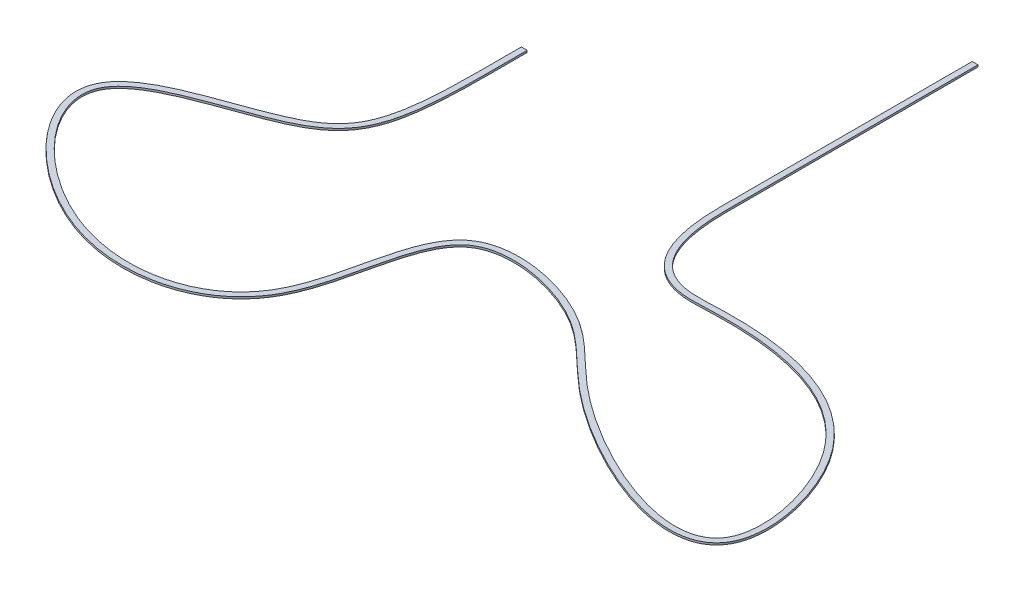
ISO-10303-21;
HEADER;
FILE_DESCRIPTION(('STEP AP214'),'2;1');
FILE_NAME('part.step','',(''),(''),'','','');
FILE_SCHEMA(('AUTOMOTIVE_DESIGN { 1 0 10303 214 1 1 1 1 }'));
ENDSEC;
DATA;
#1=APPLICATION_CONTEXT('core data for automotive mechanical design processes');
#2=APPLICATION_PROTOCOL_DEFINITION('international standard','automotive_design',2000,#1);
#3=PRODUCT_CONTEXT('',#1,'mechanical');
#4=PRODUCT('Part','Part','',(#3));
#5=PRODUCT_RELATED_PRODUCT_CATEGORY('part','',(#4));
#6=PRODUCT_DEFINITION_FORMATION('','',#4);
#7=PRODUCT_DEFINITION_CONTEXT('part definition',#1,'design');
#8=PRODUCT_DEFINITION('design','',#6,#7);
#9=PRODUCT_DEFINITION_SHAPE('','',#8);
#10=(LENGTH_UNIT() NAMED_UNIT(*) SI_UNIT(.MILLI.,.METRE.));
#11=(NAMED_UNIT(*) PLANE_ANGLE_UNIT() SI_UNIT($,.RADIAN.));
#12=(NAMED_UNIT(*) SI_UNIT($,.STERADIAN.) SOLID_ANGLE_UNIT());
#13=UNCERTAINTY_MEASURE_WITH_UNIT(LENGTH_MEASURE(1.E-05),#10,'distance_accuracy_value','');
#14=(GEOMETRIC_REPRESENTATION_CONTEXT(3) GLOBAL_UNCERTAINTY_ASSIGNED_CONTEXT((#13)) GLOBAL_UNIT_ASSIGNED_CONTEXT((#10,
#11,#12)) REPRESENTATION_CONTEXT('',''));
#15=CARTESIAN_POINT('',(0.,0.,0.));
#16=DIRECTION('',(0.,0.,1.));
#17=DIRECTION('',(1.,0.,0.));
#18=AXIS2_PLACEMENT_3D('',#15,#16,#17);
#19=CARTESIAN_POINT('',(-1770.,10.,2.20436423846524E-13));
#20=DIRECTION('',(-1.,0.,0.));
#21=DIRECTION('',(0.,0.,1.));
#22=AXIS2_PLACEMENT_3D('',#19,#20,#21);
#23=PLANE('',#22);
#24=DIRECTION('',(0.,0.,-1.));
#25=VECTOR('',#24,1.);
#26=CARTESIAN_POINT('',(-1770.,0.,2.20436423846524E-13));
#27=LINE('',#26,#25);
#28=CARTESIAN_POINT('',(-1770.,0.,200.));
#29=VERTEX_POINT('',#28);
#30=CARTESIAN_POINT('',(-1770.,0.,-1100.));
#31=VERTEX_POINT('',#30);
#32=EDGE_CURVE('E85',#29,#31,#27,.T.);
#33=ORIENTED_EDGE('',*,*,#32,.T.);
#34=DIRECTION('',(0.,-1.,0.));
#35=VECTOR('',#34,1.);
#36=CARTESIAN_POINT('',(-1770.,10.,-1100.));
#37=LINE('',#36,#35);
#38=CARTESIAN_POINT('',(-1770.,10.,-1100.));
#39=VERTEX_POINT('',#38);
#40=EDGE_CURVE('E11',#39,#31,#37,.T.);
#41=ORIENTED_EDGE('',*,*,#40,.F.);
#42=DIRECTION('',(0.,0.,-1.));
#43=VECTOR('',#42,1.);
#44=CARTESIAN_POINT('',(-1770.,10.,2.20436423846524E-13));
#45=LINE('',#44,#43);
#46=CARTESIAN_POINT('',(-1770.,10.,200.));
#47=VERTEX_POINT('',#46);
#48=EDGE_CURVE('E91',#47,#39,#45,.T.);
#49=ORIENTED_EDGE('',*,*,#48,.F.);
#50=DIRECTION('',(0.,-1.,0.));
#51=VECTOR('',#50,1.);
#52=CARTESIAN_POINT('',(-1770.,10.,200.));
#53=LINE('',#52,#51);
#54=EDGE_CURVE('E125',#47,#29,#53,.T.);
#55=ORIENTED_EDGE('',*,*,#54,.T.);
#56=EDGE_LOOP('',(#33,#41,#49,#55));
#57=FACE_BOUND('',#56,.T.);
#58=ADVANCED_FACE('F33',(#57),#23,.F.);
#59=CARTESIAN_POINT('',(-1800.,10.,-1100.));
#60=DIRECTION('',(0.,0.,1.));
#61=DIRECTION('',(1.,0.,0.));
#62=AXIS2_PLACEMENT_3D('',#59,#60,#61);
#63=PLANE('',#62);
#64=DIRECTION('',(-1.,0.,0.));
#65=VECTOR('',#64,1.);
#66=CARTESIAN_POINT('',(-1800.,0.,-1100.));
#67=LINE('',#66,#65);
#68=CARTESIAN_POINT('',(-1800.,0.,-1100.));
#69=VERTEX_POINT('',#68);
#70=EDGE_CURVE('E199',#31,#69,#67,.T.);
#71=ORIENTED_EDGE('',*,*,#70,.T.);
#72=DIRECTION('',(0.,-1.,0.));
#73=VECTOR('',#72,1.);
#74=CARTESIAN_POINT('',(-1800.,10.,-1100.));
#75=LINE('',#74,#73);
#76=CARTESIAN_POINT('',(-1800.,10.,-1100.));
#77=VERTEX_POINT('',#76);
#78=EDGE_CURVE('E41',#77,#69,#75,.T.);
#79=ORIENTED_EDGE('',*,*,#78,.F.);
#80=DIRECTION('',(-1.,0.,0.));
#81=VECTOR('',#80,1.);
#82=CARTESIAN_POINT('',(-1800.,10.,-1100.));
#83=LINE('',#82,#81);
#84=EDGE_CURVE('E168',#39,#77,#83,.T.);
#85=ORIENTED_EDGE('',*,*,#84,.F.);
#86=ORIENTED_EDGE('',*,*,#40,.T.);
#87=EDGE_LOOP('',(#71,#79,#85,#86));
#88=FACE_BOUND('',#87,.T.);
#89=ADVANCED_FACE('F198',(#88),#63,.F.);
#90=CARTESIAN_POINT('',(-1800.,10.,2.20436423846524E-13));
#91=DIRECTION('',(1.,0.,0.));
#92=DIRECTION('',(0.,0.,-1.));
#93=AXIS2_PLACEMENT_3D('',#90,#91,#92);
#94=PLANE('',#93);
#95=DIRECTION('',(0.,0.,1.));
#96=VECTOR('',#95,1.);
#97=CARTESIAN_POINT('',(-1800.,0.,2.20436423846524E-13));
#98=LINE('',#97,#96);
#99=CARTESIAN_POINT('',(-1800.,0.,200.));
#100=VERTEX_POINT('',#99);
#101=EDGE_CURVE('E194',#69,#100,#98,.T.);
#102=ORIENTED_EDGE('',*,*,#101,.T.);
#103=DIRECTION('',(0.,-1.,0.));
#104=VECTOR('',#103,1.);
#105=CARTESIAN_POINT('',(-1800.,10.,200.));
#106=LINE('',#105,#104);
#107=CARTESIAN_POINT('',(-1800.,10.,200.));
#108=VERTEX_POINT('',#107);
#109=EDGE_CURVE('E187',#108,#100,#106,.T.);
#110=ORIENTED_EDGE('',*,*,#109,.F.);
#111=DIRECTION('',(0.,0.,1.));
#112=VECTOR('',#111,1.);
#113=CARTESIAN_POINT('',(-1800.,10.,2.20436423846524E-13));
#114=LINE('',#113,#112);
#115=EDGE_CURVE('E163',#77,#108,#114,.T.);
#116=ORIENTED_EDGE('',*,*,#115,.F.);
#117=ORIENTED_EDGE('',*,*,#78,.T.);
#118=EDGE_LOOP('',(#102,#110,#116,#117));
#119=FACE_BOUND('',#118,.T.);
#120=ADVANCED_FACE('F156',(#119),#94,.F.);
#121=CARTESIAN_POINT('',(-1800.,10.,200.));
#122=CARTESIAN_POINT('',(-1800.,10.,543.775958973497));
#123=CARTESIAN_POINT('',(-1644.85776394996,10.,709.700816725594));
#124=CARTESIAN_POINT('',(-1056.46575384119,10.,667.760403918157));
#125=CARTESIAN_POINT('',(-390.715014946576,10.,787.827323273447));
#126=CARTESIAN_POINT('',(-115.852661247006,10.,2042.603655943));
#127=CARTESIAN_POINT('',(-1266.95146887229,10.,1497.62651654821));
#128=CARTESIAN_POINT('',(-1650.97261613424,10.,1003.67240354257));
#129=CARTESIAN_POINT('',(-2504.98744337853,10.,816.756429146126));
#130=CARTESIAN_POINT('',(-2411.23417557477,10.,1892.36294751749));
#131=CARTESIAN_POINT('',(-3401.54940594687,10.,2117.29933089096));
#132=CARTESIAN_POINT('',(-4308.06526892586,10.,1186.37689890447));
#133=CARTESIAN_POINT('',(-3088.78517191244,10.,965.527321936233));
#134=CARTESIAN_POINT('',(-3000.,10.,658.386110554316));
#135=CARTESIAN_POINT('',(-3000.,10.,200.));
#136=B_SPLINE_CURVE_WITH_KNOTS('',3,(#121,#122,#123,#124,#125,#126,#127,#128,#129,#130,#131,
#132,#133,#134,#135),.UNSPECIFIED.,.F.,.F.,(4,1,1,1,1,1,1,1,1,1,1,1,4),(0.,0.0680895671874227,
0.0859276568916471,0.203459509226807,0.276471939193528,0.401964241474322,0.455969173119954,
0.527914688829046,0.623416846556313,0.716393812519059,0.819188821629148,0.909166056503487,1.),.UNSPECIFIED.);
#137=DIRECTION('',(0.,-1.,0.));
#138=VECTOR('',#137,1.);
#139=SURFACE_OF_LINEAR_EXTRUSION('',#136,#138);
#140=CARTESIAN_POINT('',(-1800.,0.,200.));
#141=CARTESIAN_POINT('',(-1800.,0.,543.775958973497));
#142=CARTESIAN_POINT('',(-1644.85776394996,0.,709.700816725594));
#143=CARTESIAN_POINT('',(-1056.46575384119,0.,667.760403918157));
#144=CARTESIAN_POINT('',(-390.715014946576,0.,787.827323273447));
#145=CARTESIAN_POINT('',(-115.852661247006,0.,2042.603655943));
#146=CARTESIAN_POINT('',(-1266.95146887229,0.,1497.62651654821));
#147=CARTESIAN_POINT('',(-1650.97261613424,0.,1003.67240354257));
#148=CARTESIAN_POINT('',(-2504.98744337853,0.,816.756429146126));
#149=CARTESIAN_POINT('',(-2411.23417557477,0.,1892.36294751749));
#150=CARTESIAN_POINT('',(-3401.54940594687,0.,2117.29933089096));
#151=CARTESIAN_POINT('',(-4308.06526892586,0.,1186.37689890447));
#152=CARTESIAN_POINT('',(-3088.78517191244,0.,965.527321936233));
#153=CARTESIAN_POINT('',(-3000.,0.,658.386110554316));
#154=CARTESIAN_POINT('',(-3000.,0.,200.));
#155=B_SPLINE_CURVE_WITH_KNOTS('',3,(#140,#141,#142,#143,#144,#145,#146,#147,#148,#149,#150,
#151,#152,#153,#154),.UNSPECIFIED.,.F.,.F.,(4,1,1,1,1,1,1,1,1,1,1,1,4),(0.,0.0680895671874227,
0.0859276568916471,0.203459509226807,0.276471939193528,0.401964241474322,0.455969173119954,
0.527914688829046,0.623416846556313,0.716393812519059,0.819188821629148,0.909166056503487,1.),.UNSPECIFIED.);
#156=CARTESIAN_POINT('',(-3000.,0.,200.));
#157=VERTEX_POINT('',#156);
#158=EDGE_CURVE('E200',#100,#157,#155,.T.);
#159=ORIENTED_EDGE('',*,*,#158,.T.);
#160=DIRECTION('',(0.,-1.,0.));
#161=VECTOR('',#160,1.);
#162=CARTESIAN_POINT('',(-3000.,10.,200.));
#163=LINE('',#162,#161);
#164=CARTESIAN_POINT('',(-3000.,10.,200.));
#165=VERTEX_POINT('',#164);
#166=EDGE_CURVE('E184',#165,#157,#163,.T.);
#167=ORIENTED_EDGE('',*,*,#166,.F.);
#168=EDGE_CURVE('E158',#108,#165,#136,.T.);
#169=ORIENTED_EDGE('',*,*,#168,.F.);
#170=ORIENTED_EDGE('',*,*,#109,.T.);
#171=EDGE_LOOP('',(#159,#167,#169,#170));
#172=FACE_BOUND('',#171,.T.);
#173=ADVANCED_FACE('F151',(#172),#139,.F.);
#174=CARTESIAN_POINT('',(-3000.,10.,0.));
#175=DIRECTION('',(-1.,0.,0.));
#176=DIRECTION('',(0.,0.,1.));
#177=AXIS2_PLACEMENT_3D('',#174,#175,#176);
#178=PLANE('',#177);
#179=DIRECTION('',(0.,0.,-1.));
#180=VECTOR('',#179,1.);
#181=CARTESIAN_POINT('',(-3000.,0.,0.));
#182=LINE('',#181,#180);
#183=CARTESIAN_POINT('',(-3000.,0.,0.));
#184=VERTEX_POINT('',#183);
#185=EDGE_CURVE('E206',#157,#184,#182,.T.);
#186=ORIENTED_EDGE('',*,*,#185,.T.);
#187=DIRECTION('',(0.,-1.,0.));
#188=VECTOR('',#187,1.);
#189=CARTESIAN_POINT('',(-3000.,10.,0.));
#190=LINE('',#189,#188);
#191=CARTESIAN_POINT('',(-3000.,10.,0.));
#192=VERTEX_POINT('',#191);
#193=EDGE_CURVE('E120',#192,#184,#190,.T.);
#194=ORIENTED_EDGE('',*,*,#193,.F.);
#195=DIRECTION('',(0.,0.,-1.));
#196=VECTOR('',#195,1.);
#197=CARTESIAN_POINT('',(-3000.,10.,0.));
#198=LINE('',#197,#196);
#199=EDGE_CURVE('E111',#165,#192,#198,.T.);
#200=ORIENTED_EDGE('',*,*,#199,.F.);
#201=ORIENTED_EDGE('',*,*,#166,.T.);
#202=EDGE_LOOP('',(#186,#194,#200,#201));
#203=FACE_BOUND('',#202,.T.);
#204=ADVANCED_FACE('F148',(#203),#178,.F.);
#205=CARTESIAN_POINT('',(-3030.,10.,0.));
#206=DIRECTION('',(0.,0.,1.));
#207=DIRECTION('',(1.,0.,0.));
#208=AXIS2_PLACEMENT_3D('',#205,#206,#207);
#209=PLANE('',#208);
#210=DIRECTION('',(-1.,0.,0.));
#211=VECTOR('',#210,1.);
#212=CARTESIAN_POINT('',(-3030.,0.,0.));
#213=LINE('',#212,#211);
#214=CARTESIAN_POINT('',(-3030.,0.,0.));
#215=VERTEX_POINT('',#214);
#216=EDGE_CURVE('E119',#184,#215,#213,.T.);
#217=ORIENTED_EDGE('',*,*,#216,.T.);
#218=DIRECTION('',(0.,-1.,0.));
#219=VECTOR('',#218,1.);
#220=CARTESIAN_POINT('',(-3030.,10.,0.));
#221=LINE('',#220,#219);
#222=CARTESIAN_POINT('',(-3030.,10.,0.));
#223=VERTEX_POINT('',#222);
#224=EDGE_CURVE('E116',#223,#215,#221,.T.);
#225=ORIENTED_EDGE('',*,*,#224,.F.);
#226=DIRECTION('',(-1.,0.,0.));
#227=VECTOR('',#226,1.);
#228=CARTESIAN_POINT('',(-3030.,10.,0.));
#229=LINE('',#228,#227);
#230=EDGE_CURVE('E105',#192,#223,#229,.T.);
#231=ORIENTED_EDGE('',*,*,#230,.F.);
#232=ORIENTED_EDGE('',*,*,#193,.T.);
#233=EDGE_LOOP('',(#217,#225,#231,#232));
#234=FACE_BOUND('',#233,.T.);
#235=ADVANCED_FACE('F117',(#234),#209,.F.);
#236=CARTESIAN_POINT('',(-3030.,10.,0.));
#237=DIRECTION('',(1.,0.,0.));
#238=DIRECTION('',(0.,0.,-1.));
#239=AXIS2_PLACEMENT_3D('',#236,#237,#238);
#240=PLANE('',#239);
#241=DIRECTION('',(0.,0.,1.));
#242=VECTOR('',#241,1.);
#243=CARTESIAN_POINT('',(-3030.,0.,0.));
#244=LINE('',#243,#242);
#245=CARTESIAN_POINT('',(-3030.,0.,200.));
#246=VERTEX_POINT('',#245);
#247=EDGE_CURVE('E78',#215,#246,#244,.T.);
#248=ORIENTED_EDGE('',*,*,#247,.T.);
#249=DIRECTION('',(0.,-1.,0.));
#250=VECTOR('',#249,1.);
#251=CARTESIAN_POINT('',(-3030.,10.,200.));
#252=LINE('',#251,#250);
#253=CARTESIAN_POINT('',(-3030.,10.,200.));
#254=VERTEX_POINT('',#253);
#255=EDGE_CURVE('E121',#254,#246,#252,.T.);
#256=ORIENTED_EDGE('',*,*,#255,.F.);
#257=DIRECTION('',(0.,0.,1.));
#258=VECTOR('',#257,1.);
#259=CARTESIAN_POINT('',(-3030.,10.,0.));
#260=LINE('',#259,#258);
#261=EDGE_CURVE('E109',#223,#254,#260,.T.);
#262=ORIENTED_EDGE('',*,*,#261,.F.);
#263=ORIENTED_EDGE('',*,*,#224,.T.);
#264=EDGE_LOOP('',(#248,#256,#262,#263));
#265=FACE_BOUND('',#264,.T.);
#266=ADVANCED_FACE('F123',(#265),#240,.F.);
#267=CARTESIAN_POINT('',(-3030.,10.,200.));
#268=CARTESIAN_POINT('',(-3030.,10.,202.44468026223));
#269=CARTESIAN_POINT('',(-3030.00256678984,10.,207.346983279905));
#270=CARTESIAN_POINT('',(-3030.01812400814,10.,217.04804120218));
#271=CARTESIAN_POINT('',(-3030.05740794864,10.,229.052437646049));
#272=CARTESIAN_POINT('',(-3030.13722424219,10.,243.241965806248));
#273=CARTESIAN_POINT('',(-3030.28845649301,10.,261.884067124718));
#274=CARTESIAN_POINT('',(-3030.56384189688,10.,284.667648803494));
#275=CARTESIAN_POINT('',(-3031.03984896304,10.,311.19300127468));
#276=CARTESIAN_POINT('',(-3031.66872717967,10.,336.91739267088));
#277=CARTESIAN_POINT('',(-3032.72071490951,10.,370.167689688053));
#278=CARTESIAN_POINT('',(-3034.45393286476,10.,409.799220315622));
#279=CARTESIAN_POINT('',(-3037.25898119917,10.,454.379166511088));
#280=CARTESIAN_POINT('',(-3040.84294969377,10.,496.09249968465));
#281=CARTESIAN_POINT('',(-3045.25683784207,10.,535.049982743481));
#282=CARTESIAN_POINT('',(-3052.31151555034,10.,583.467747888372));
#283=CARTESIAN_POINT('',(-3063.43357501031,10.,637.660079414597));
#284=CARTESIAN_POINT('',(-3080.76493448546,10.,693.52693384983));
#285=CARTESIAN_POINT('',(-3102.3500102706,10.,741.368378302608));
#286=CARTESIAN_POINT('',(-3128.57449992123,10.,782.579038728643));
#287=CARTESIAN_POINT('',(-3160.12592561099,10.,818.701202856934));
#288=CARTESIAN_POINT('',(-3197.96128777108,10.,851.116250208338));
#289=CARTESIAN_POINT('',(-3235.52799002765,10.,875.916153702686));
#290=CARTESIAN_POINT('',(-3269.55411577885,10.,894.840403096033));
#291=CARTESIAN_POINT('',(-3297.17028016858,10.,908.686773964042));
#292=CARTESIAN_POINT('',(-3326.76723459712,10.,922.266159263917));
#293=CARTESIAN_POINT('',(-3368.47074079309,10.,940.048003300012));
#294=CARTESIAN_POINT('',(-3424.17276609938,10.,961.792286148216));
#295=CARTESIAN_POINT('',(-3494.70503097047,10.,987.573106580423));
#296=CARTESIAN_POINT('',(-3566.97385975147,10.,1013.57433379743));
#297=CARTESIAN_POINT('',(-3639.07252594547,10.,1040.3687673254));
#298=CARTESIAN_POINT('',(-3709.14181427762,10.,1068.57149167922));
#299=CARTESIAN_POINT('',(-3775.37176871665,10.,1098.85629541707));
#300=CARTESIAN_POINT('',(-3836.00695500734,10.,1132.00152055109));
#301=CARTESIAN_POINT('',(-3889.31678833922,10.,1168.9757265393));
#302=CARTESIAN_POINT('',(-3926.11845085338,10.,1204.07393873081));
#303=CARTESIAN_POINT('',(-3949.73224874865,10.,1235.52501961107));
#304=CARTESIAN_POINT('',(-3961.68523529989,10.,1256.70098547685));
#305=CARTESIAN_POINT('',(-3969.31242434488,10.,1274.59391953308));
#306=CARTESIAN_POINT('',(-3975.52712625,10.,1292.91049616912));
#307=CARTESIAN_POINT('',(-3980.70403246672,10.,1316.47601152373));
#308=CARTESIAN_POINT('',(-3982.96666732529,10.,1345.47364758785));
#309=CARTESIAN_POINT('',(-3981.08090854941,10.,1384.75673749048));
#310=CARTESIAN_POINT('',(-3970.24921824339,10.,1434.58773513265));
#311=CARTESIAN_POINT('',(-3945.61552459571,10.,1494.86054712761));
#312=CARTESIAN_POINT('',(-3910.76909211951,10.,1555.15322765712));
#313=CARTESIAN_POINT('',(-3866.87655204438,10.,1614.8985842291));
#314=CARTESIAN_POINT('',(-3797.70187990741,10.,1692.91817347662));
#315=CARTESIAN_POINT('',(-3714.5891943424,10.,1766.95876076713));
#316=CARTESIAN_POINT('',(-3621.53078436277,10.,1833.65102352948));
#317=CARTESIAN_POINT('',(-3547.74988015527,10.,1879.10122375944));
#318=CARTESIAN_POINT('',(-3470.95798782769,10.,1919.07688843198));
#319=CARTESIAN_POINT('',(-3405.26515749913,10.,1947.05882325373));
#320=CARTESIAN_POINT('',(-3352.15092319672,10.,1965.7590894277));
#321=CARTESIAN_POINT('',(-3298.90758680479,10.,1981.8639978442));
#322=CARTESIAN_POINT('',(-3232.30478941012,10.,1997.18768236058));
#323=CARTESIAN_POINT('',(-3152.95269088712,10.,2007.94530770781));
#324=CARTESIAN_POINT('',(-3048.76963456727,10.,2012.20366296019));
#325=CARTESIAN_POINT('',(-2923.18761040135,10.,1998.76134898343));
#326=CARTESIAN_POINT('',(-2808.15741515661,10.,1960.56234263952));
#327=CARTESIAN_POINT('',(-2725.24500383772,10.,1915.25416550836));
#328=CARTESIAN_POINT('',(-2668.366927617,10.,1873.94133501317));
#329=CARTESIAN_POINT('',(-2626.03502170989,10.,1833.46896077764));
#330=CARTESIAN_POINT('',(-2595.60981509827,10.,1797.52865155095));
#331=CARTESIAN_POINT('',(-2574.60280289815,10.,1768.8220596565));
#332=CARTESIAN_POINT('',(-2555.53351124245,10.,1738.36463936736));
#333=CARTESIAN_POINT('',(-2538.47690065025,10.,1706.56190141997));
#334=CARTESIAN_POINT('',(-2523.16833259899,10.,1673.58842288324));
#335=CARTESIAN_POINT('',(-2504.82806612773,10.,1628.31895502311));
#336=CARTESIAN_POINT('',(-2485.26527832442,10.,1569.72592814881));
#337=CARTESIAN_POINT('',(-2459.07674383719,10.,1473.53737758828));
#338=CARTESIAN_POINT('',(-2437.6009988882,10.,1376.4116244579));
#339=CARTESIAN_POINT('',(-2415.35342626781,10.,1284.0649564692));
#340=CARTESIAN_POINT('',(-2397.01659975555,10.,1218.70885942529));
#341=CARTESIAN_POINT('',(-2375.84355131772,10.,1158.80447303158));
#342=CARTESIAN_POINT('',(-2350.80649780114,10.,1105.90597815358));
#343=CARTESIAN_POINT('',(-2326.05115687181,10.,1068.84210020599));
#344=CARTESIAN_POINT('',(-2303.5286706809,10.,1043.84828198856));
#345=CARTESIAN_POINT('',(-2288.20414804714,10.,1030.19801575286));
#346=CARTESIAN_POINT('',(-2275.08539370571,10.,1020.46260096111));
#347=CARTESIAN_POINT('',(-2261.37226191134,10.,1011.53750141805));
#348=CARTESIAN_POINT('',(-2242.77503625664,10.,1001.72441998259));
#349=CARTESIAN_POINT('',(-2218.20902846381,10.,992.055597619226));
#350=CARTESIAN_POINT('',(-2182.67550462291,10.,981.97676893033));
#351=CARTESIAN_POINT('',(-2133.5428540093,10.,974.635212352723));
#352=CARTESIAN_POINT('',(-2068.92496513719,10.,973.960416534671));
#353=CARTESIAN_POINT('',(-2000.63486849878,10.,980.879053648074));
#354=CARTESIAN_POINT('',(-1930.62363706019,10.,994.698759185792));
#355=CARTESIAN_POINT('',(-1860.80117514704,10.,1014.64078034145));
#356=CARTESIAN_POINT('',(-1804.33934481401,10.,1035.66868330747));
#357=CARTESIAN_POINT('',(-1761.1360388575,10.,1054.69806181579));
#358=CARTESIAN_POINT('',(-1729.95180312396,10.,1069.95859176504));
#359=CARTESIAN_POINT('',(-1700.21149425171,10.,1086.08890541635));
#360=CARTESIAN_POINT('',(-1672.18010006703,10.,1102.96511617994));
#361=CARTESIAN_POINT('',(-1645.56824606733,10.,1120.62338221644));
#362=CARTESIAN_POINT('',(-1611.64269172637,10.,1145.16268059825));
#363=CARTESIAN_POINT('',(-1571.52863480319,10.,1177.65396346366));
#364=CARTESIAN_POINT('',(-1525.13823940885,10.,1219.32908618434));
#365=CARTESIAN_POINT('',(-1478.63882768336,10.,1263.37878955179));
#366=CARTESIAN_POINT('',(-1438.27384428108,10.,1301.72055375505));
#367=CARTESIAN_POINT('',(-1404.10166103781,10.,1333.12662338878));
#368=CARTESIAN_POINT('',(-1377.30857403191,10.,1356.97636767243));
#369=CARTESIAN_POINT('',(-1349.11595266121,10.,1381.06430101926));
#370=CARTESIAN_POINT('',(-1309.4116860319,10.,1413.34336745606));
#371=CARTESIAN_POINT('',(-1256.29263528121,10.,1453.60329377825));
#372=CARTESIAN_POINT('',(-1187.87308852633,10.,1501.16400635612));
#373=CARTESIAN_POINT('',(-1091.72023474866,10.,1562.63600046953));
#374=CARTESIAN_POINT('',(-964.711485154699,10.,1634.09420715975));
#375=CARTESIAN_POINT('',(-809.130631111526,10.,1705.53925452926));
#376=CARTESIAN_POINT('',(-683.143800982305,10.,1748.35807532738));
#377=CARTESIAN_POINT('',(-588.060593850463,10.,1769.57939621431));
#378=CARTESIAN_POINT('',(-520.373003956374,10.,1778.14849527007));
#379=CARTESIAN_POINT('',(-457.011107667601,10.,1778.41475552728));
#380=CARTESIAN_POINT('',(-398.643469016427,10.,1769.15473299937));
#381=CARTESIAN_POINT('',(-354.952102158264,10.,1752.08820605141));
#382=CARTESIAN_POINT('',(-324.014060839887,10.,1731.97421397463));
#383=CARTESIAN_POINT('',(-303.227579333491,10.,1713.57186275693));
#384=CARTESIAN_POINT('',(-288.250771315608,10.,1695.51553361057));
#385=CARTESIAN_POINT('',(-277.838355606863,10.,1679.50915900354));
#386=CARTESIAN_POINT('',(-268.557478325612,10.,1662.6616615934));
#387=CARTESIAN_POINT('',(-258.960804034451,10.,1640.14140507716));
#388=CARTESIAN_POINT('',(-247.525559019261,10.,1601.43587709904));
#389=CARTESIAN_POINT('',(-239.930582836491,10.,1548.62900383139));
#390=CARTESIAN_POINT('',(-240.088873901011,10.,1479.68758561624));
#391=CARTESIAN_POINT('',(-248.575943032091,10.,1406.66146019611));
#392=CARTESIAN_POINT('',(-264.657490326098,10.,1331.16604421734));
#393=CARTESIAN_POINT('',(-287.700104096437,10.,1254.90335708829));
#394=CARTESIAN_POINT('',(-317.127338875256,10.,1179.62521342066));
#395=CARTESIAN_POINT('',(-352.390309535108,10.,1107.12873484128));
#396=CARTESIAN_POINT('',(-393.039510754311,10.,1039.16142748892));
#397=CARTESIAN_POINT('',(-438.500486415111,10.,977.718973596922));
#398=CARTESIAN_POINT('',(-504.847882610184,10.,904.377483855463));
#399=CARTESIAN_POINT('',(-597.557567260527,10.,828.133172733128));
#400=CARTESIAN_POINT('',(-721.017084363719,10.,759.174762999476));
#401=CARTESIAN_POINT('',(-831.370487173833,10.,718.37574199146));
#402=CARTESIAN_POINT('',(-922.641439477638,10.,694.420768142469));
#403=CARTESIAN_POINT('',(-992.234696422972,10.,680.469889050314));
#404=CARTESIAN_POINT('',(-1062.61775413724,10.,670.211613646285));
#405=CARTESIAN_POINT('',(-1133.44599841174,10.,663.327883193615));
#406=CARTESIAN_POINT('',(-1192.55500007956,10.,660.142266979799));
#407=CARTESIAN_POINT('',(-1239.72317718289,10.,658.969581147324));
#408=CARTESIAN_POINT('',(-1274.99616358221,10.,658.739624883118));
#409=CARTESIAN_POINT('',(-1304.27208732321,10.,659.057585107903));
#410=CARTESIAN_POINT('',(-1327.59310051896,10.,659.598465100132));
#411=CARTESIAN_POINT('',(-1345.04758331539,10.,660.143281780053));
#412=CARTESIAN_POINT('',(-1362.38335077414,10.,660.819948012066));
#413=CARTESIAN_POINT('',(-1385.19718472514,10.,661.789097925377));
#414=CARTESIAN_POINT('',(-1413.13260064818,10.,662.933694109778));
#415=CARTESIAN_POINT('',(-1445.4598262798,10.,663.598851609646));
#416=CARTESIAN_POINT('',(-1476.35704834531,10.,663.000331669724));
#417=CARTESIAN_POINT('',(-1505.44643721926,10.,660.596707519195));
#418=CARTESIAN_POINT('',(-1533.12244128007,10.,656.050035993142));
#419=CARTESIAN_POINT('',(-1559.33456329788,10.,649.355896109645));
#420=CARTESIAN_POINT('',(-1592.31421988826,10.,637.474865982917));
#421=CARTESIAN_POINT('',(-1629.87210566305,10.,616.930624639397));
#422=CARTESIAN_POINT('',(-1669.43917741045,10.,582.165052240562));
#423=CARTESIAN_POINT('',(-1697.94044284547,10.,543.3842645943));
#424=CARTESIAN_POINT('',(-1717.7804475355,10.,505.615714454527));
#425=CARTESIAN_POINT('',(-1731.06056765678,10.,473.742739490945));
#426=CARTESIAN_POINT('',(-1742.61900187938,10.,438.169198210849));
#427=CARTESIAN_POINT('',(-1752.3298075487,10.,398.765721216262));
#428=CARTESIAN_POINT('',(-1758.7819365191,10.,362.643523781912));
#429=CARTESIAN_POINT('',(-1762.90294184075,10.,331.722987205455));
#430=CARTESIAN_POINT('',(-1765.46003299359,10.,307.50908034012));
#431=CARTESIAN_POINT('',(-1767.47048440508,10.,282.259565392284));
#432=CARTESIAN_POINT('',(-1768.67991445953,10.,260.345781839055));
#433=CARTESIAN_POINT('',(-1769.36185012833,10.,242.284652732584));
#434=CARTESIAN_POINT('',(-1769.72902742436,10.,228.474147380825));
#435=CARTESIAN_POINT('',(-1769.91356736719,10.,216.737336548021));
#436=CARTESIAN_POINT('',(-1769.98761895009,10.,207.224491945918));
#437=CARTESIAN_POINT('',(-1770.,10.,202.402726684964));
#438=CARTESIAN_POINT('',(-1770.,10.,200.));
#439=B_SPLINE_CURVE_WITH_KNOTS('',3,(#267,#268,#269,#270,#271,#272,#273,#274,#275,#276,#277,
#278,#279,#280,#281,#282,#283,#284,#285,#286,#287,#288,#289,#290,#291,#292,#293,#294,#295,#296,
#297,#298,#299,#300,#301,#302,#303,#304,#305,#306,#307,#308,#309,#310,#311,#312,#313,#314,#315,
#316,#317,#318,#319,#320,#321,#322,#323,#324,#325,#326,#327,#328,#329,#330,#331,#332,#333,#334,
#335,#336,#337,#338,#339,#340,#341,#342,#343,#344,#345,#346,#347,#348,#349,#350,#351,#352,#353,
#354,#355,#356,#357,#358,#359,#360,#361,#362,#363,#364,#365,#366,#367,#368,#369,#370,#371,#372,
#373,#374,#375,#376,#377,#378,#379,#380,#381,#382,#383,#384,#385,#386,#387,#388,#389,#390,#391,
#392,#393,#394,#395,#396,#397,#398,#399,#400,#401,#402,#403,#404,#405,#406,#407,#408,#409,#410,
#411,#412,#413,#414,#415,#416,#417,#418,#419,#420,#421,#422,#423,#424,#425,#426,#427,#428,#429,
#430,#431,#432,#433,#434,#435,#436,#437,#438),.UNSPECIFIED.,.F.,.F.,(4,1,1,1,1,1,1,1,1,1,1,1,1,
1,1,1,1,1,1,1,1,1,1,1,1,1,1,1,1,1,1,1,1,1,1,1,1,1,1,1,1,1,1,1,1,1,1,1,1,1,1,1,1,1,1,1,1,1,1,1,1,
1,1,1,1,1,1,1,1,1,1,1,1,1,1,1,1,1,1,1,1,1,1,1,1,1,1,1,1,1,1,1,1,1,1,1,1,1,1,1,1,1,1,1,1,1,1,1,1,
1,1,1,1,1,1,1,1,1,1,1,1,1,1,1,1,1,1,1,1,1,1,1,1,1,1,1,1,1,1,1,1,1,1,1,1,1,1,1,1,1,1,1,1,1,1,1,1,
1,1,1,1,1,1,1,1,1,1,1,1,4),(0.,0.00048828125,0.0009765625,0.001953125,0.0029296875,0.00390625,
0.005859375,0.0078125,0.009765625,0.01171875,0.015625,0.01953125,0.0234375,0.02734375,0.03125,
0.0390625,0.046875,0.0546875,0.0625,0.0703125,0.078125,0.0859375,0.08984375,0.09375,0.09765625,
0.1015625,0.109375,0.1171875,0.125,0.1328125,0.140625,0.1484375,0.15625,0.1640625,0.171875,
0.17578125,0.1796875,0.181640625,0.18359375,0.1875,0.19140625,0.1953125,0.203125,0.2109375,
0.21875,0.2265625,0.234375,0.25,0.2578125,0.265625,0.2734375,0.28125,0.28515625,0.2890625,
0.296875,0.3046875,0.3125,0.328125,0.34375,0.3515625,0.359375,0.3671875,0.37109375,0.375,
0.37890625,0.3828125,0.38671875,0.390625,0.3984375,0.40625,0.421875,0.4296875,0.4375,0.4453125,
0.453125,0.4609375,0.46484375,0.46875,0.470703125,0.47265625,0.4765625,0.48046875,0.484375,
0.4921875,0.5,0.5078125,0.515625,0.5234375,0.53125,0.53515625,0.5390625,0.54296875,0.546875,
0.55078125,0.5546875,0.5625,0.5703125,0.578125,0.5859375,0.58984375,0.59375,0.59765625,
0.6015625,0.609375,0.6171875,0.625,0.640625,0.65625,0.671875,0.6796875,0.6875,0.6953125,
0.703125,0.7109375,0.71484375,0.71875,0.72265625,0.724609375,0.7265625,0.73046875,0.734375,
0.7421875,0.75,0.7578125,0.765625,0.7734375,0.78125,0.7890625,0.796875,0.8046875,0.8125,
0.828125,0.84375,0.859375,0.8671875,0.875,0.8828125,0.890625,0.8984375,0.90234375,0.90625,
0.91015625,0.912109375,0.9140625,0.916015625,0.91796875,0.921875,0.92578125,0.9296875,
0.93359375,0.9375,0.94140625,0.9453125,0.953125,0.9609375,0.96875,0.97265625,0.9765625,
0.98046875,0.984375,0.98828125,0.990234375,0.9921875,0.994140625,0.99609375,0.9970703125,
0.998046875,0.9990234375,0.99951171875,1.),.UNSPECIFIED.);
#440=DIRECTION('',(0.,-1.,0.));
#441=VECTOR('',#440,1.);
#442=SURFACE_OF_LINEAR_EXTRUSION('',#439,#441);
#443=CARTESIAN_POINT('',(-3030.,0.,200.));
#444=CARTESIAN_POINT('',(-3030.,0.,202.44468026223));
#445=CARTESIAN_POINT('',(-3030.00256678984,0.,207.346983279905));
#446=CARTESIAN_POINT('',(-3030.01812400814,0.,217.04804120218));
#447=CARTESIAN_POINT('',(-3030.05740794864,0.,229.052437646049));
#448=CARTESIAN_POINT('',(-3030.13722424219,0.,243.241965806248));
#449=CARTESIAN_POINT('',(-3030.28845649301,0.,261.884067124718));
#450=CARTESIAN_POINT('',(-3030.56384189688,0.,284.667648803494));
#451=CARTESIAN_POINT('',(-3031.03984896304,0.,311.19300127468));
#452=CARTESIAN_POINT('',(-3031.66872717967,0.,336.91739267088));
#453=CARTESIAN_POINT('',(-3032.72071490951,0.,370.167689688053));
#454=CARTESIAN_POINT('',(-3034.45393286476,0.,409.799220315622));
#455=CARTESIAN_POINT('',(-3037.25898119917,0.,454.379166511088));
#456=CARTESIAN_POINT('',(-3040.84294969377,0.,496.09249968465));
#457=CARTESIAN_POINT('',(-3045.25683784207,0.,535.049982743481));
#458=CARTESIAN_POINT('',(-3052.31151555034,0.,583.467747888372));
#459=CARTESIAN_POINT('',(-3063.43357501031,0.,637.660079414597));
#460=CARTESIAN_POINT('',(-3080.76493448546,0.,693.52693384983));
#461=CARTESIAN_POINT('',(-3102.3500102706,0.,741.368378302608));
#462=CARTESIAN_POINT('',(-3128.57449992123,0.,782.579038728643));
#463=CARTESIAN_POINT('',(-3160.12592561099,0.,818.701202856934));
#464=CARTESIAN_POINT('',(-3197.96128777108,0.,851.116250208338));
#465=CARTESIAN_POINT('',(-3235.52799002765,0.,875.916153702686));
#466=CARTESIAN_POINT('',(-3269.55411577885,0.,894.840403096033));
#467=CARTESIAN_POINT('',(-3297.17028016858,0.,908.686773964042));
#468=CARTESIAN_POINT('',(-3326.76723459712,0.,922.266159263917));
#469=CARTESIAN_POINT('',(-3368.47074079309,0.,940.048003300012));
#470=CARTESIAN_POINT('',(-3424.17276609938,0.,961.792286148216));
#471=CARTESIAN_POINT('',(-3494.70503097047,0.,987.573106580423));
#472=CARTESIAN_POINT('',(-3566.97385975147,0.,1013.57433379743));
#473=CARTESIAN_POINT('',(-3639.07252594547,0.,1040.3687673254));
#474=CARTESIAN_POINT('',(-3709.14181427762,0.,1068.57149167922));
#475=CARTESIAN_POINT('',(-3775.37176871665,0.,1098.85629541707));
#476=CARTESIAN_POINT('',(-3836.00695500734,0.,1132.00152055109));
#477=CARTESIAN_POINT('',(-3889.31678833922,0.,1168.9757265393));
#478=CARTESIAN_POINT('',(-3926.11845085338,0.,1204.07393873081));
#479=CARTESIAN_POINT('',(-3949.73224874865,0.,1235.52501961107));
#480=CARTESIAN_POINT('',(-3961.68523529989,0.,1256.70098547685));
#481=CARTESIAN_POINT('',(-3969.31242434488,0.,1274.59391953308));
#482=CARTESIAN_POINT('',(-3975.52712625,0.,1292.91049616912));
#483=CARTESIAN_POINT('',(-3980.70403246672,0.,1316.47601152373));
#484=CARTESIAN_POINT('',(-3982.96666732529,0.,1345.47364758785));
#485=CARTESIAN_POINT('',(-3981.08090854941,0.,1384.75673749048));
#486=CARTESIAN_POINT('',(-3970.24921824339,0.,1434.58773513265));
#487=CARTESIAN_POINT('',(-3945.61552459571,0.,1494.86054712761));
#488=CARTESIAN_POINT('',(-3910.76909211951,0.,1555.15322765712));
#489=CARTESIAN_POINT('',(-3866.87655204438,0.,1614.8985842291));
#490=CARTESIAN_POINT('',(-3797.70187990741,0.,1692.91817347662));
#491=CARTESIAN_POINT('',(-3714.5891943424,0.,1766.95876076713));
#492=CARTESIAN_POINT('',(-3621.53078436277,0.,1833.65102352948));
#493=CARTESIAN_POINT('',(-3547.74988015527,0.,1879.10122375944));
#494=CARTESIAN_POINT('',(-3470.95798782769,0.,1919.07688843198));
#495=CARTESIAN_POINT('',(-3405.26515749913,0.,1947.05882325373));
#496=CARTESIAN_POINT('',(-3352.15092319672,0.,1965.7590894277));
#497=CARTESIAN_POINT('',(-3298.90758680479,0.,1981.8639978442));
#498=CARTESIAN_POINT('',(-3232.30478941012,0.,1997.18768236058));
#499=CARTESIAN_POINT('',(-3152.95269088712,0.,2007.94530770781));
#500=CARTESIAN_POINT('',(-3048.76963456727,0.,2012.20366296019));
#501=CARTESIAN_POINT('',(-2923.18761040135,0.,1998.76134898343));
#502=CARTESIAN_POINT('',(-2808.15741515661,0.,1960.56234263952));
#503=CARTESIAN_POINT('',(-2725.24500383772,0.,1915.25416550836));
#504=CARTESIAN_POINT('',(-2668.366927617,0.,1873.94133501317));
#505=CARTESIAN_POINT('',(-2626.03502170989,0.,1833.46896077764));
#506=CARTESIAN_POINT('',(-2595.60981509827,0.,1797.52865155095));
#507=CARTESIAN_POINT('',(-2574.60280289815,0.,1768.8220596565));
#508=CARTESIAN_POINT('',(-2555.53351124245,0.,1738.36463936736));
#509=CARTESIAN_POINT('',(-2538.47690065025,0.,1706.56190141997));
#510=CARTESIAN_POINT('',(-2523.16833259899,0.,1673.58842288324));
#511=CARTESIAN_POINT('',(-2504.82806612773,0.,1628.31895502311));
#512=CARTESIAN_POINT('',(-2485.26527832442,0.,1569.72592814881));
#513=CARTESIAN_POINT('',(-2459.07674383719,0.,1473.53737758828));
#514=CARTESIAN_POINT('',(-2437.6009988882,0.,1376.4116244579));
#515=CARTESIAN_POINT('',(-2415.35342626781,0.,1284.0649564692));
#516=CARTESIAN_POINT('',(-2397.01659975555,0.,1218.70885942529));
#517=CARTESIAN_POINT('',(-2375.84355131772,0.,1158.80447303158));
#518=CARTESIAN_POINT('',(-2350.80649780114,0.,1105.90597815358));
#519=CARTESIAN_POINT('',(-2326.05115687181,0.,1068.84210020599));
#520=CARTESIAN_POINT('',(-2303.5286706809,0.,1043.84828198856));
#521=CARTESIAN_POINT('',(-2288.20414804714,0.,1030.19801575286));
#522=CARTESIAN_POINT('',(-2275.08539370571,0.,1020.46260096111));
#523=CARTESIAN_POINT('',(-2261.37226191134,0.,1011.53750141805));
#524=CARTESIAN_POINT('',(-2242.77503625664,0.,1001.72441998259));
#525=CARTESIAN_POINT('',(-2218.20902846381,0.,992.055597619226));
#526=CARTESIAN_POINT('',(-2182.67550462291,0.,981.97676893033));
#527=CARTESIAN_POINT('',(-2133.5428540093,0.,974.635212352723));
#528=CARTESIAN_POINT('',(-2068.92496513719,0.,973.960416534671));
#529=CARTESIAN_POINT('',(-2000.63486849878,0.,980.879053648074));
#530=CARTESIAN_POINT('',(-1930.62363706019,0.,994.698759185792));
#531=CARTESIAN_POINT('',(-1860.80117514704,0.,1014.64078034145));
#532=CARTESIAN_POINT('',(-1804.33934481401,0.,1035.66868330747));
#533=CARTESIAN_POINT('',(-1761.1360388575,0.,1054.69806181579));
#534=CARTESIAN_POINT('',(-1729.95180312396,0.,1069.95859176504));
#535=CARTESIAN_POINT('',(-1700.21149425171,0.,1086.08890541635));
#536=CARTESIAN_POINT('',(-1672.18010006703,0.,1102.96511617994));
#537=CARTESIAN_POINT('',(-1645.56824606733,0.,1120.62338221644));
#538=CARTESIAN_POINT('',(-1611.64269172637,0.,1145.16268059825));
#539=CARTESIAN_POINT('',(-1571.52863480319,0.,1177.65396346366));
#540=CARTESIAN_POINT('',(-1525.13823940885,0.,1219.32908618434));
#541=CARTESIAN_POINT('',(-1478.63882768336,0.,1263.37878955179));
#542=CARTESIAN_POINT('',(-1438.27384428108,0.,1301.72055375505));
#543=CARTESIAN_POINT('',(-1404.10166103781,0.,1333.12662338878));
#544=CARTESIAN_POINT('',(-1377.30857403191,0.,1356.97636767243));
#545=CARTESIAN_POINT('',(-1349.11595266121,0.,1381.06430101926));
#546=CARTESIAN_POINT('',(-1309.4116860319,0.,1413.34336745606));
#547=CARTESIAN_POINT('',(-1256.29263528121,0.,1453.60329377825));
#548=CARTESIAN_POINT('',(-1187.87308852633,0.,1501.16400635612));
#549=CARTESIAN_POINT('',(-1091.72023474866,0.,1562.63600046953));
#550=CARTESIAN_POINT('',(-964.711485154699,0.,1634.09420715975));
#551=CARTESIAN_POINT('',(-809.130631111526,0.,1705.53925452926));
#552=CARTESIAN_POINT('',(-683.143800982305,0.,1748.35807532738));
#553=CARTESIAN_POINT('',(-588.060593850463,0.,1769.57939621431));
#554=CARTESIAN_POINT('',(-520.373003956374,0.,1778.14849527007));
#555=CARTESIAN_POINT('',(-457.011107667601,0.,1778.41475552728));
#556=CARTESIAN_POINT('',(-398.643469016427,0.,1769.15473299937));
#557=CARTESIAN_POINT('',(-354.952102158264,0.,1752.08820605141));
#558=CARTESIAN_POINT('',(-324.014060839887,0.,1731.97421397463));
#559=CARTESIAN_POINT('',(-303.227579333491,0.,1713.57186275693));
#560=CARTESIAN_POINT('',(-288.250771315608,0.,1695.51553361057));
#561=CARTESIAN_POINT('',(-277.838355606863,0.,1679.50915900354));
#562=CARTESIAN_POINT('',(-268.557478325612,0.,1662.6616615934));
#563=CARTESIAN_POINT('',(-258.960804034451,0.,1640.14140507716));
#564=CARTESIAN_POINT('',(-247.525559019261,0.,1601.43587709904));
#565=CARTESIAN_POINT('',(-239.930582836491,0.,1548.62900383139));
#566=CARTESIAN_POINT('',(-240.088873901011,0.,1479.68758561624));
#567=CARTESIAN_POINT('',(-248.575943032091,0.,1406.66146019611));
#568=CARTESIAN_POINT('',(-264.657490326098,0.,1331.16604421734));
#569=CARTESIAN_POINT('',(-287.700104096437,0.,1254.90335708829));
#570=CARTESIAN_POINT('',(-317.127338875256,0.,1179.62521342066));
#571=CARTESIAN_POINT('',(-352.390309535108,0.,1107.12873484128));
#572=CARTESIAN_POINT('',(-393.039510754311,0.,1039.16142748892));
#573=CARTESIAN_POINT('',(-438.500486415111,0.,977.718973596922));
#574=CARTESIAN_POINT('',(-504.847882610184,0.,904.377483855463));
#575=CARTESIAN_POINT('',(-597.557567260527,0.,828.133172733128));
#576=CARTESIAN_POINT('',(-721.017084363719,0.,759.174762999476));
#577=CARTESIAN_POINT('',(-831.370487173833,0.,718.37574199146));
#578=CARTESIAN_POINT('',(-922.641439477638,0.,694.420768142469));
#579=CARTESIAN_POINT('',(-992.234696422972,0.,680.469889050314));
#580=CARTESIAN_POINT('',(-1062.61775413724,0.,670.211613646285));
#581=CARTESIAN_POINT('',(-1133.44599841174,0.,663.327883193615));
#582=CARTESIAN_POINT('',(-1192.55500007956,0.,660.142266979799));
#583=CARTESIAN_POINT('',(-1239.72317718289,0.,658.969581147324));
#584=CARTESIAN_POINT('',(-1274.99616358221,0.,658.739624883118));
#585=CARTESIAN_POINT('',(-1304.27208732321,0.,659.057585107903));
#586=CARTESIAN_POINT('',(-1327.59310051896,0.,659.598465100132));
#587=CARTESIAN_POINT('',(-1345.04758331539,0.,660.143281780053));
#588=CARTESIAN_POINT('',(-1362.38335077414,0.,660.819948012066));
#589=CARTESIAN_POINT('',(-1385.19718472514,0.,661.789097925377));
#590=CARTESIAN_POINT('',(-1413.13260064818,0.,662.933694109778));
#591=CARTESIAN_POINT('',(-1445.4598262798,0.,663.598851609646));
#592=CARTESIAN_POINT('',(-1476.35704834531,0.,663.000331669724));
#593=CARTESIAN_POINT('',(-1505.44643721926,0.,660.596707519195));
#594=CARTESIAN_POINT('',(-1533.12244128007,0.,656.050035993142));
#595=CARTESIAN_POINT('',(-1559.33456329788,0.,649.355896109645));
#596=CARTESIAN_POINT('',(-1592.31421988826,0.,637.474865982917));
#597=CARTESIAN_POINT('',(-1629.87210566305,0.,616.930624639397));
#598=CARTESIAN_POINT('',(-1669.43917741045,0.,582.165052240562));
#599=CARTESIAN_POINT('',(-1697.94044284547,0.,543.3842645943));
#600=CARTESIAN_POINT('',(-1717.7804475355,0.,505.615714454527));
#601=CARTESIAN_POINT('',(-1731.06056765678,0.,473.742739490945));
#602=CARTESIAN_POINT('',(-1742.61900187938,0.,438.169198210849));
#603=CARTESIAN_POINT('',(-1752.3298075487,0.,398.765721216262));
#604=CARTESIAN_POINT('',(-1758.7819365191,0.,362.643523781912));
#605=CARTESIAN_POINT('',(-1762.90294184075,0.,331.722987205455));
#606=CARTESIAN_POINT('',(-1765.46003299359,0.,307.50908034012));
#607=CARTESIAN_POINT('',(-1767.47048440508,0.,282.259565392284));
#608=CARTESIAN_POINT('',(-1768.67991445953,0.,260.345781839055));
#609=CARTESIAN_POINT('',(-1769.36185012833,0.,242.284652732584));
#610=CARTESIAN_POINT('',(-1769.72902742436,0.,228.474147380825));
#611=CARTESIAN_POINT('',(-1769.91356736719,0.,216.737336548021));
#612=CARTESIAN_POINT('',(-1769.98761895009,0.,207.224491945918));
#613=CARTESIAN_POINT('',(-1770.,0.,202.402726684964));
#614=CARTESIAN_POINT('',(-1770.,0.,200.));
#615=B_SPLINE_CURVE_WITH_KNOTS('',3,(#443,#444,#445,#446,#447,#448,#449,#450,#451,#452,#453,
#454,#455,#456,#457,#458,#459,#460,#461,#462,#463,#464,#465,#466,#467,#468,#469,#470,#471,#472,
#473,#474,#475,#476,#477,#478,#479,#480,#481,#482,#483,#484,#485,#486,#487,#488,#489,#490,#491,
#492,#493,#494,#495,#496,#497,#498,#499,#500,#501,#502,#503,#504,#505,#506,#507,#508,#509,#510,
#511,#512,#513,#514,#515,#516,#517,#518,#519,#520,#521,#522,#523,#524,#525,#526,#527,#528,#529,
#530,#531,#532,#533,#534,#535,#536,#537,#538,#539,#540,#541,#542,#543,#544,#545,#546,#547,#548,
#549,#550,#551,#552,#553,#554,#555,#556,#557,#558,#559,#560,#561,#562,#563,#564,#565,#566,#567,
#568,#569,#570,#571,#572,#573,#574,#575,#576,#577,#578,#579,#580,#581,#582,#583,#584,#585,#586,
#587,#588,#589,#590,#591,#592,#593,#594,#595,#596,#597,#598,#599,#600,#601,#602,#603,#604,#605,
#606,#607,#608,#609,#610,#611,#612,#613,#614),.UNSPECIFIED.,.F.,.F.,(4,1,1,1,1,1,1,1,1,1,1,1,1,
1,1,1,1,1,1,1,1,1,1,1,1,1,1,1,1,1,1,1,1,1,1,1,1,1,1,1,1,1,1,1,1,1,1,1,1,1,1,1,1,1,1,1,1,1,1,1,1,
1,1,1,1,1,1,1,1,1,1,1,1,1,1,1,1,1,1,1,1,1,1,1,1,1,1,1,1,1,1,1,1,1,1,1,1,1,1,1,1,1,1,1,1,1,1,1,1,
1,1,1,1,1,1,1,1,1,1,1,1,1,1,1,1,1,1,1,1,1,1,1,1,1,1,1,1,1,1,1,1,1,1,1,1,1,1,1,1,1,1,1,1,1,1,1,1,
1,1,1,1,1,1,1,1,1,1,1,1,4),(0.,0.00048828125,0.0009765625,0.001953125,0.0029296875,0.00390625,
0.005859375,0.0078125,0.009765625,0.01171875,0.015625,0.01953125,0.0234375,0.02734375,0.03125,
0.0390625,0.046875,0.0546875,0.0625,0.0703125,0.078125,0.0859375,0.08984375,0.09375,0.09765625,
0.1015625,0.109375,0.1171875,0.125,0.1328125,0.140625,0.1484375,0.15625,0.1640625,0.171875,
0.17578125,0.1796875,0.181640625,0.18359375,0.1875,0.19140625,0.1953125,0.203125,0.2109375,
0.21875,0.2265625,0.234375,0.25,0.2578125,0.265625,0.2734375,0.28125,0.28515625,0.2890625,
0.296875,0.3046875,0.3125,0.328125,0.34375,0.3515625,0.359375,0.3671875,0.37109375,0.375,
0.37890625,0.3828125,0.38671875,0.390625,0.3984375,0.40625,0.421875,0.4296875,0.4375,0.4453125,
0.453125,0.4609375,0.46484375,0.46875,0.470703125,0.47265625,0.4765625,0.48046875,0.484375,
0.4921875,0.5,0.5078125,0.515625,0.5234375,0.53125,0.53515625,0.5390625,0.54296875,0.546875,
0.55078125,0.5546875,0.5625,0.5703125,0.578125,0.5859375,0.58984375,0.59375,0.59765625,
0.6015625,0.609375,0.6171875,0.625,0.640625,0.65625,0.671875,0.6796875,0.6875,0.6953125,
0.703125,0.7109375,0.71484375,0.71875,0.72265625,0.724609375,0.7265625,0.73046875,0.734375,
0.7421875,0.75,0.7578125,0.765625,0.7734375,0.78125,0.7890625,0.796875,0.8046875,0.8125,
0.828125,0.84375,0.859375,0.8671875,0.875,0.8828125,0.890625,0.8984375,0.90234375,0.90625,
0.91015625,0.912109375,0.9140625,0.916015625,0.91796875,0.921875,0.92578125,0.9296875,
0.93359375,0.9375,0.94140625,0.9453125,0.953125,0.9609375,0.96875,0.97265625,0.9765625,
0.98046875,0.984375,0.98828125,0.990234375,0.9921875,0.994140625,0.99609375,0.9970703125,
0.998046875,0.9990234375,0.99951171875,1.),.UNSPECIFIED.);
#616=EDGE_CURVE('E170',#246,#29,#615,.T.);
#617=ORIENTED_EDGE('',*,*,#616,.T.);
#618=ORIENTED_EDGE('',*,*,#54,.F.);
#619=EDGE_CURVE('E49',#254,#47,#439,.T.);
#620=ORIENTED_EDGE('',*,*,#619,.F.);
#621=ORIENTED_EDGE('',*,*,#255,.T.);
#622=EDGE_LOOP('',(#617,#618,#620,#621));
#623=FACE_BOUND('',#622,.T.);
#624=ADVANCED_FACE('F137',(#623),#442,.F.);
#625=CARTESIAN_POINT('',(-2068.31293050947,10.,975.225988689913));
#626=DIRECTION('',(0.,-1.,0.));
#627=DIRECTION('',(0.,0.,-1.));
#628=AXIS2_PLACEMENT_3D('',#625,#626,#627);
#629=PLANE('',#628);
#630=ORIENTED_EDGE('',*,*,#48,.T.);
#631=ORIENTED_EDGE('',*,*,#84,.T.);
#632=ORIENTED_EDGE('',*,*,#115,.T.);
#633=ORIENTED_EDGE('',*,*,#168,.T.);
#634=ORIENTED_EDGE('',*,*,#199,.T.);
#635=ORIENTED_EDGE('',*,*,#230,.T.);
#636=ORIENTED_EDGE('',*,*,#261,.T.);
#637=ORIENTED_EDGE('',*,*,#619,.T.);
#638=EDGE_LOOP('',(#630,#631,#632,#633,#634,#635,#636,#637));
#639=FACE_BOUND('',#638,.T.);
#640=ADVANCED_FACE('F107',(#639),#629,.F.);
#641=CARTESIAN_POINT('',(-2068.31293050947,0.,975.225988689913));
#642=DIRECTION('',(0.,-1.,0.));
#643=DIRECTION('',(0.,0.,-1.));
#644=AXIS2_PLACEMENT_3D('',#641,#642,#643);
#645=PLANE('',#644);
#646=ORIENTED_EDGE('',*,*,#32,.F.);
#647=ORIENTED_EDGE('',*,*,#616,.F.);
#648=ORIENTED_EDGE('',*,*,#247,.F.);
#649=ORIENTED_EDGE('',*,*,#216,.F.);
#650=ORIENTED_EDGE('',*,*,#185,.F.);
#651=ORIENTED_EDGE('',*,*,#158,.F.);
#652=ORIENTED_EDGE('',*,*,#101,.F.);
#653=ORIENTED_EDGE('',*,*,#70,.F.);
#654=EDGE_LOOP('',(#646,#647,#648,#649,#650,#651,#652,#653));
#655=FACE_BOUND('',#654,.T.);
#656=ADVANCED_FACE('F142',(#655),#645,.T.);
#657=CLOSED_SHELL('',(#58,#89,#120,#173,#204,#235,#266,#624,#640,#656));
#658=MANIFOLD_SOLID_BREP('B2',#657);
#659=ADVANCED_BREP_SHAPE_REPRESENTATION('',(#18,#658),#14);
#660=SHAPE_DEFINITION_REPRESENTATION(#9,#659);
ENDSEC;
END-ISO-10303-21;
